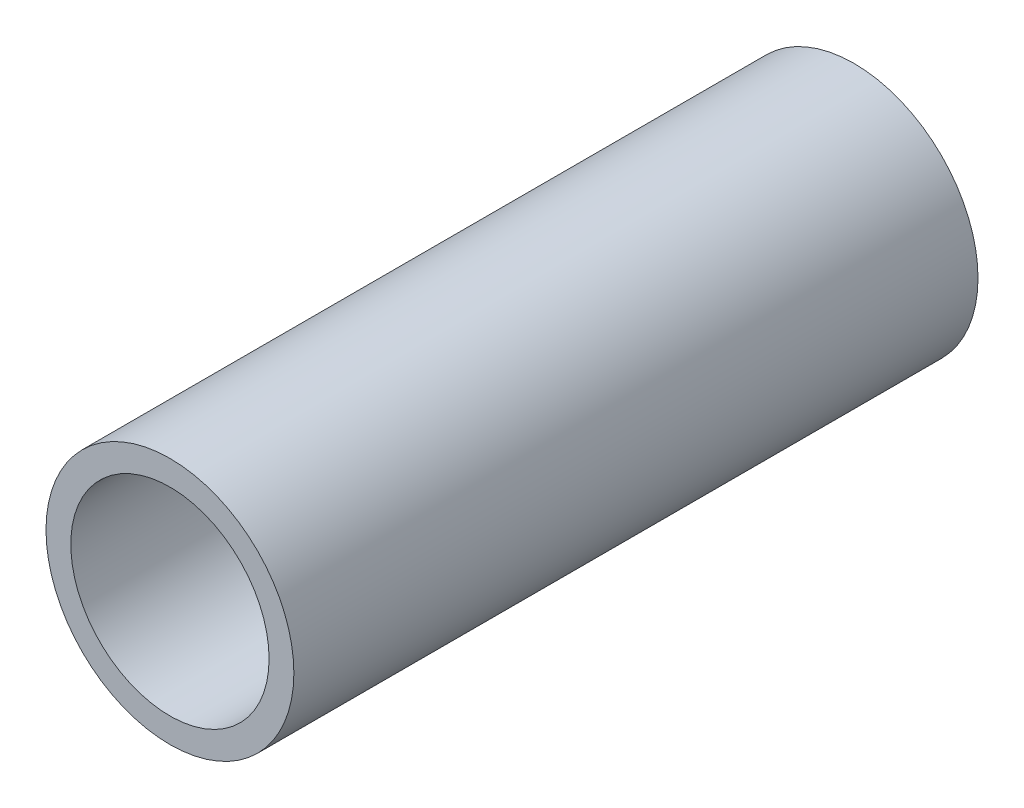
ISO-10303-21;
HEADER;
FILE_DESCRIPTION(('STEP AP214'),'2;1');
FILE_NAME('part.step','',(''),(''),'','','');
FILE_SCHEMA(('AUTOMOTIVE_DESIGN { 1 0 10303 214 1 1 1 1 }'));
ENDSEC;
DATA;
#1=APPLICATION_CONTEXT('core data for automotive mechanical design processes');
#2=APPLICATION_PROTOCOL_DEFINITION('international standard','automotive_design',2000,#1);
#3=PRODUCT_CONTEXT('',#1,'mechanical');
#4=PRODUCT('Part','Part','',(#3));
#5=PRODUCT_RELATED_PRODUCT_CATEGORY('part','',(#4));
#6=PRODUCT_DEFINITION_FORMATION('','',#4);
#7=PRODUCT_DEFINITION_CONTEXT('part definition',#1,'design');
#8=PRODUCT_DEFINITION('design','',#6,#7);
#9=PRODUCT_DEFINITION_SHAPE('','',#8);
#10=(LENGTH_UNIT() NAMED_UNIT(*) SI_UNIT(.MILLI.,.METRE.));
#11=(NAMED_UNIT(*) PLANE_ANGLE_UNIT() SI_UNIT($,.RADIAN.));
#12=(NAMED_UNIT(*) SI_UNIT($,.STERADIAN.) SOLID_ANGLE_UNIT());
#13=UNCERTAINTY_MEASURE_WITH_UNIT(LENGTH_MEASURE(1.E-05),#10,'distance_accuracy_value','');
#14=(GEOMETRIC_REPRESENTATION_CONTEXT(3) GLOBAL_UNCERTAINTY_ASSIGNED_CONTEXT((#13)) GLOBAL_UNIT_ASSIGNED_CONTEXT((#10,
#11,#12)) REPRESENTATION_CONTEXT('',''));
#15=CARTESIAN_POINT('',(0.,0.,0.));
#16=DIRECTION('',(0.,0.,1.));
#17=DIRECTION('',(1.,0.,0.));
#18=AXIS2_PLACEMENT_3D('',#15,#16,#17);
#19=CARTESIAN_POINT('',(0.,0.,-6.9));
#20=DIRECTION('',(0.,0.,1.));
#21=DIRECTION('',(1.,0.,0.));
#22=AXIS2_PLACEMENT_3D('',#19,#20,#21);
#23=CYLINDRICAL_SURFACE('',#22,1.25);
#24=CARTESIAN_POINT('',(0.,0.,-6.9));
#25=DIRECTION('',(0.,0.,1.));
#26=DIRECTION('',(1.,0.,0.));
#27=AXIS2_PLACEMENT_3D('',#24,#25,#26);
#28=CIRCLE('',#27,1.25);
#29=CARTESIAN_POINT('',(1.25,0.,-6.9));
#30=VERTEX_POINT('',#29);
#31=EDGE_CURVE('E10',#30,#30,#28,.T.);
#32=CARTESIAN_POINT('',(0.,0.,0.));
#33=DIRECTION('',(0.,0.,1.));
#34=DIRECTION('',(1.,0.,0.));
#35=AXIS2_PLACEMENT_3D('',#32,#33,#34);
#36=CIRCLE('',#35,1.25);
#37=CARTESIAN_POINT('',(1.25,0.,0.));
#38=VERTEX_POINT('',#37);
#39=EDGE_CURVE('E38',#38,#38,#36,.T.);
#40=CARTESIAN_POINT('',(1.25,0.,-6.9));
#41=CARTESIAN_POINT('',(1.25,0.,-6.828125));
#42=CARTESIAN_POINT('',(1.25,0.,-6.75625));
#43=CARTESIAN_POINT('',(1.25,0.,-6.6125));
#44=CARTESIAN_POINT('',(1.25,0.,-6.540625));
#45=CARTESIAN_POINT('',(1.25,0.,-6.396875));
#46=CARTESIAN_POINT('',(1.25,0.,-6.325));
#47=CARTESIAN_POINT('',(1.25,0.,-6.18125));
#48=CARTESIAN_POINT('',(1.25,0.,-6.109375));
#49=CARTESIAN_POINT('',(1.25,0.,-5.965625));
#50=CARTESIAN_POINT('',(1.25,0.,-5.89375));
#51=CARTESIAN_POINT('',(1.25,0.,-5.75));
#52=CARTESIAN_POINT('',(1.25,0.,-5.678125));
#53=CARTESIAN_POINT('',(1.25,0.,-5.534375));
#54=CARTESIAN_POINT('',(1.25,0.,-5.4625));
#55=CARTESIAN_POINT('',(1.25,0.,-5.31875));
#56=CARTESIAN_POINT('',(1.25,0.,-5.246875));
#57=CARTESIAN_POINT('',(1.25,0.,-5.103125));
#58=CARTESIAN_POINT('',(1.25,0.,-5.03125));
#59=CARTESIAN_POINT('',(1.25,0.,-4.8875));
#60=CARTESIAN_POINT('',(1.25,0.,-4.815625));
#61=CARTESIAN_POINT('',(1.25,0.,-4.671875));
#62=CARTESIAN_POINT('',(1.25,0.,-4.6));
#63=CARTESIAN_POINT('',(1.25,0.,-4.45625));
#64=CARTESIAN_POINT('',(1.25,0.,-4.384375));
#65=CARTESIAN_POINT('',(1.25,0.,-4.240625));
#66=CARTESIAN_POINT('',(1.25,0.,-4.16875));
#67=CARTESIAN_POINT('',(1.25,0.,-4.025));
#68=CARTESIAN_POINT('',(1.25,0.,-3.953125));
#69=CARTESIAN_POINT('',(1.25,0.,-3.809375));
#70=CARTESIAN_POINT('',(1.25,0.,-3.7375));
#71=CARTESIAN_POINT('',(1.25,0.,-3.59375));
#72=CARTESIAN_POINT('',(1.25,0.,-3.521875));
#73=CARTESIAN_POINT('',(1.25,0.,-3.378125));
#74=CARTESIAN_POINT('',(1.25,0.,-3.30625));
#75=CARTESIAN_POINT('',(1.25,0.,-3.1625));
#76=CARTESIAN_POINT('',(1.25,0.,-3.090625));
#77=CARTESIAN_POINT('',(1.25,0.,-2.946875));
#78=CARTESIAN_POINT('',(1.25,0.,-2.875));
#79=CARTESIAN_POINT('',(1.25,0.,-2.73125));
#80=CARTESIAN_POINT('',(1.25,0.,-2.659375));
#81=CARTESIAN_POINT('',(1.25,0.,-2.515625));
#82=CARTESIAN_POINT('',(1.25,0.,-2.44375));
#83=CARTESIAN_POINT('',(1.25,0.,-2.3));
#84=CARTESIAN_POINT('',(1.25,0.,-2.228125));
#85=CARTESIAN_POINT('',(1.25,0.,-2.084375));
#86=CARTESIAN_POINT('',(1.25,0.,-2.0125));
#87=CARTESIAN_POINT('',(1.25,0.,-1.86875));
#88=CARTESIAN_POINT('',(1.25,0.,-1.796875));
#89=CARTESIAN_POINT('',(1.25,0.,-1.653125));
#90=CARTESIAN_POINT('',(1.25,0.,-1.58125));
#91=CARTESIAN_POINT('',(1.25,0.,-1.4375));
#92=CARTESIAN_POINT('',(1.25,0.,-1.365625));
#93=CARTESIAN_POINT('',(1.25,0.,-1.221875));
#94=CARTESIAN_POINT('',(1.25,0.,-1.15));
#95=CARTESIAN_POINT('',(1.25,0.,-1.00625));
#96=CARTESIAN_POINT('',(1.25,0.,-0.934375));
#97=CARTESIAN_POINT('',(1.25,0.,-0.790625));
#98=CARTESIAN_POINT('',(1.25,0.,-0.71875));
#99=CARTESIAN_POINT('',(1.25,0.,-0.575));
#100=CARTESIAN_POINT('',(1.25,0.,-0.503125));
#101=CARTESIAN_POINT('',(1.25,0.,-0.359375));
#102=CARTESIAN_POINT('',(1.25,0.,-0.2875));
#103=CARTESIAN_POINT('',(1.25,0.,-0.14375));
#104=CARTESIAN_POINT('',(1.25,0.,-0.0718749999999998));
#105=CARTESIAN_POINT('',(1.25,0.,0.));
#106=B_SPLINE_CURVE_WITH_KNOTS('',3,(#40,#41,#42,#43,#44,#45,#46,#47,#48,#49,#50,#51,#52,#53,
#54,#55,#56,#57,#58,#59,#60,#61,#62,#63,#64,#65,#66,#67,#68,#69,#70,#71,#72,#73,#74,#75,#76,#77,
#78,#79,#80,#81,#82,#83,#84,#85,#86,#87,#88,#89,#90,#91,#92,#93,#94,#95,#96,#97,#98,#99,#100,
#101,#102,#103,#104,#105),.UNSPECIFIED.,.F.,.F.,(4,2,2,2,2,2,2,2,2,2,2,2,2,2,2,2,2,2,2,2,2,2,2,
2,2,2,2,2,2,2,2,2,4),(0.,0.215625,0.431249999999999,0.646875,0.8625,1.078125,1.29375,1.509375,
1.725,1.940625,2.15625,2.371875,2.5875,2.803125,3.01875,3.234375,3.45,3.665625,3.88125,4.096875,
4.3125,4.528125,4.74375,4.959375,5.175,5.390625,5.60625,5.821875,6.0375,6.253125,6.46875,
6.684375,6.9),.UNSPECIFIED.);
#107=EDGE_CURVE('BSEAM35',#30,#38,#106,.T.);
#108=ORIENTED_EDGE('',*,*,#31,.T.);
#109=ORIENTED_EDGE('',*,*,#39,.F.);
#110=ORIENTED_EDGE('',*,*,#107,.T.);
#111=ORIENTED_EDGE('',*,*,#107,.F.);
#112=EDGE_LOOP('',(#108,#110,#109,#111));
#113=FACE_BOUND('',#112,.T.);
#114=ADVANCED_FACE('F35',(#113),#23,.T.);
#115=CARTESIAN_POINT('',(0.,0.,-6.9));
#116=DIRECTION('',(0.,0.,1.));
#117=DIRECTION('',(1.,0.,0.));
#118=AXIS2_PLACEMENT_3D('',#115,#116,#117);
#119=PLANE('',#118);
#120=CARTESIAN_POINT('',(0.,0.,-6.9));
#121=DIRECTION('',(0.,0.,1.));
#122=DIRECTION('',(1.,0.,0.));
#123=AXIS2_PLACEMENT_3D('',#120,#121,#122);
#124=CIRCLE('',#123,1.);
#125=CARTESIAN_POINT('',(1.,0.,-6.9));
#126=VERTEX_POINT('',#125);
#127=EDGE_CURVE('E45',#126,#126,#124,.T.);
#128=ORIENTED_EDGE('',*,*,#127,.T.);
#129=EDGE_LOOP('',(#128));
#130=FACE_BOUND('',#129,.T.);
#131=ORIENTED_EDGE('',*,*,#31,.F.);
#132=EDGE_LOOP('',(#131));
#133=FACE_BOUND('',#132,.T.);
#134=ADVANCED_FACE('F53',(#130,#133),#119,.F.);
#135=CARTESIAN_POINT('',(0.,0.,0.));
#136=DIRECTION('',(0.,0.,1.));
#137=DIRECTION('',(1.,0.,0.));
#138=AXIS2_PLACEMENT_3D('',#135,#136,#137);
#139=PLANE('',#138);
#140=CARTESIAN_POINT('',(0.,0.,0.));
#141=DIRECTION('',(0.,0.,1.));
#142=DIRECTION('',(1.,0.,0.));
#143=AXIS2_PLACEMENT_3D('',#140,#141,#142);
#144=CIRCLE('',#143,1.);
#145=CARTESIAN_POINT('',(1.,0.,0.));
#146=VERTEX_POINT('',#145);
#147=EDGE_CURVE('E47',#146,#146,#144,.T.);
#148=ORIENTED_EDGE('',*,*,#147,.F.);
#149=EDGE_LOOP('',(#148));
#150=FACE_BOUND('',#149,.T.);
#151=ORIENTED_EDGE('',*,*,#39,.T.);
#152=EDGE_LOOP('',(#151));
#153=FACE_BOUND('',#152,.T.);
#154=ADVANCED_FACE('F59',(#150,#153),#139,.T.);
#155=CARTESIAN_POINT('',(0.,0.,-6.9));
#156=DIRECTION('',(0.,0.,1.));
#157=DIRECTION('',(1.,0.,0.));
#158=AXIS2_PLACEMENT_3D('',#155,#156,#157);
#159=CYLINDRICAL_SURFACE('',#158,1.);
#160=CARTESIAN_POINT('',(1.,0.,-6.9));
#161=CARTESIAN_POINT('',(1.,0.,-6.828125));
#162=CARTESIAN_POINT('',(1.,0.,-6.75625));
#163=CARTESIAN_POINT('',(1.,0.,-6.6125));
#164=CARTESIAN_POINT('',(1.,0.,-6.540625));
#165=CARTESIAN_POINT('',(1.,0.,-6.396875));
#166=CARTESIAN_POINT('',(1.,0.,-6.325));
#167=CARTESIAN_POINT('',(1.,0.,-6.18125));
#168=CARTESIAN_POINT('',(1.,0.,-6.109375));
#169=CARTESIAN_POINT('',(1.,0.,-5.965625));
#170=CARTESIAN_POINT('',(1.,0.,-5.89375));
#171=CARTESIAN_POINT('',(1.,0.,-5.75));
#172=CARTESIAN_POINT('',(1.,0.,-5.678125));
#173=CARTESIAN_POINT('',(1.,0.,-5.534375));
#174=CARTESIAN_POINT('',(1.,0.,-5.4625));
#175=CARTESIAN_POINT('',(1.,0.,-5.31875));
#176=CARTESIAN_POINT('',(1.,0.,-5.246875));
#177=CARTESIAN_POINT('',(1.,0.,-5.103125));
#178=CARTESIAN_POINT('',(1.,0.,-5.03125));
#179=CARTESIAN_POINT('',(1.,0.,-4.8875));
#180=CARTESIAN_POINT('',(1.,0.,-4.815625));
#181=CARTESIAN_POINT('',(1.,0.,-4.671875));
#182=CARTESIAN_POINT('',(1.,0.,-4.6));
#183=CARTESIAN_POINT('',(1.,0.,-4.45625));
#184=CARTESIAN_POINT('',(1.,0.,-4.384375));
#185=CARTESIAN_POINT('',(1.,0.,-4.240625));
#186=CARTESIAN_POINT('',(1.,0.,-4.16875));
#187=CARTESIAN_POINT('',(1.,0.,-4.025));
#188=CARTESIAN_POINT('',(1.,0.,-3.953125));
#189=CARTESIAN_POINT('',(1.,0.,-3.809375));
#190=CARTESIAN_POINT('',(1.,0.,-3.7375));
#191=CARTESIAN_POINT('',(1.,0.,-3.59375));
#192=CARTESIAN_POINT('',(1.,0.,-3.521875));
#193=CARTESIAN_POINT('',(1.,0.,-3.378125));
#194=CARTESIAN_POINT('',(1.,0.,-3.30625));
#195=CARTESIAN_POINT('',(1.,0.,-3.1625));
#196=CARTESIAN_POINT('',(1.,0.,-3.090625));
#197=CARTESIAN_POINT('',(1.,0.,-2.946875));
#198=CARTESIAN_POINT('',(1.,0.,-2.875));
#199=CARTESIAN_POINT('',(1.,0.,-2.73125));
#200=CARTESIAN_POINT('',(1.,0.,-2.659375));
#201=CARTESIAN_POINT('',(1.,0.,-2.515625));
#202=CARTESIAN_POINT('',(1.,0.,-2.44375));
#203=CARTESIAN_POINT('',(1.,0.,-2.3));
#204=CARTESIAN_POINT('',(1.,0.,-2.228125));
#205=CARTESIAN_POINT('',(1.,0.,-2.084375));
#206=CARTESIAN_POINT('',(1.,0.,-2.0125));
#207=CARTESIAN_POINT('',(1.,0.,-1.86875));
#208=CARTESIAN_POINT('',(1.,0.,-1.796875));
#209=CARTESIAN_POINT('',(1.,0.,-1.653125));
#210=CARTESIAN_POINT('',(1.,0.,-1.58125));
#211=CARTESIAN_POINT('',(1.,0.,-1.4375));
#212=CARTESIAN_POINT('',(1.,0.,-1.365625));
#213=CARTESIAN_POINT('',(1.,0.,-1.221875));
#214=CARTESIAN_POINT('',(1.,0.,-1.15));
#215=CARTESIAN_POINT('',(1.,0.,-1.00625));
#216=CARTESIAN_POINT('',(1.,0.,-0.934375));
#217=CARTESIAN_POINT('',(1.,0.,-0.790625));
#218=CARTESIAN_POINT('',(1.,0.,-0.71875));
#219=CARTESIAN_POINT('',(1.,0.,-0.575));
#220=CARTESIAN_POINT('',(1.,0.,-0.503125));
#221=CARTESIAN_POINT('',(1.,0.,-0.359375));
#222=CARTESIAN_POINT('',(1.,0.,-0.2875));
#223=CARTESIAN_POINT('',(1.,0.,-0.14375));
#224=CARTESIAN_POINT('',(1.,0.,-0.0718749999999998));
#225=CARTESIAN_POINT('',(1.,0.,0.));
#226=B_SPLINE_CURVE_WITH_KNOTS('',3,(#160,#161,#162,#163,#164,#165,#166,#167,#168,#169,#170,
#171,#172,#173,#174,#175,#176,#177,#178,#179,#180,#181,#182,#183,#184,#185,#186,#187,#188,#189,
#190,#191,#192,#193,#194,#195,#196,#197,#198,#199,#200,#201,#202,#203,#204,#205,#206,#207,#208,
#209,#210,#211,#212,#213,#214,#215,#216,#217,#218,#219,#220,#221,#222,#223,#224,#225),
.UNSPECIFIED.,.F.,.F.,(4,2,2,2,2,2,2,2,2,2,2,2,2,2,2,2,2,2,2,2,2,2,2,2,2,2,2,2,2,2,2,2,4),(0.,
0.215625,0.431249999999999,0.646875,0.8625,1.078125,1.29375,1.509375,1.725,1.940625,2.15625,
2.371875,2.5875,2.803125,3.01875,3.234375,3.45,3.665625,3.88125,4.096875,4.3125,4.528125,
4.74375,4.959375,5.175,5.390625,5.60625,5.821875,6.0375,6.253125,6.46875,6.684375,6.9),.UNSPECIFIED.);
#227=EDGE_CURVE('BSEAM56',#126,#146,#226,.T.);
#228=ORIENTED_EDGE('',*,*,#127,.F.);
#229=ORIENTED_EDGE('',*,*,#147,.T.);
#230=ORIENTED_EDGE('',*,*,#227,.T.);
#231=ORIENTED_EDGE('',*,*,#227,.F.);
#232=EDGE_LOOP('',(#228,#230,#229,#231));
#233=FACE_BOUND('',#232,.T.);
#234=ADVANCED_FACE('F56',(#233),#159,.F.);
#235=CLOSED_SHELL('',(#114,#134,#154,#234));
#236=MANIFOLD_SOLID_BREP('B2',#235);
#237=ADVANCED_BREP_SHAPE_REPRESENTATION('',(#18,#236),#14);
#238=SHAPE_DEFINITION_REPRESENTATION(#9,#237);
ENDSEC;
END-ISO-10303-21;
